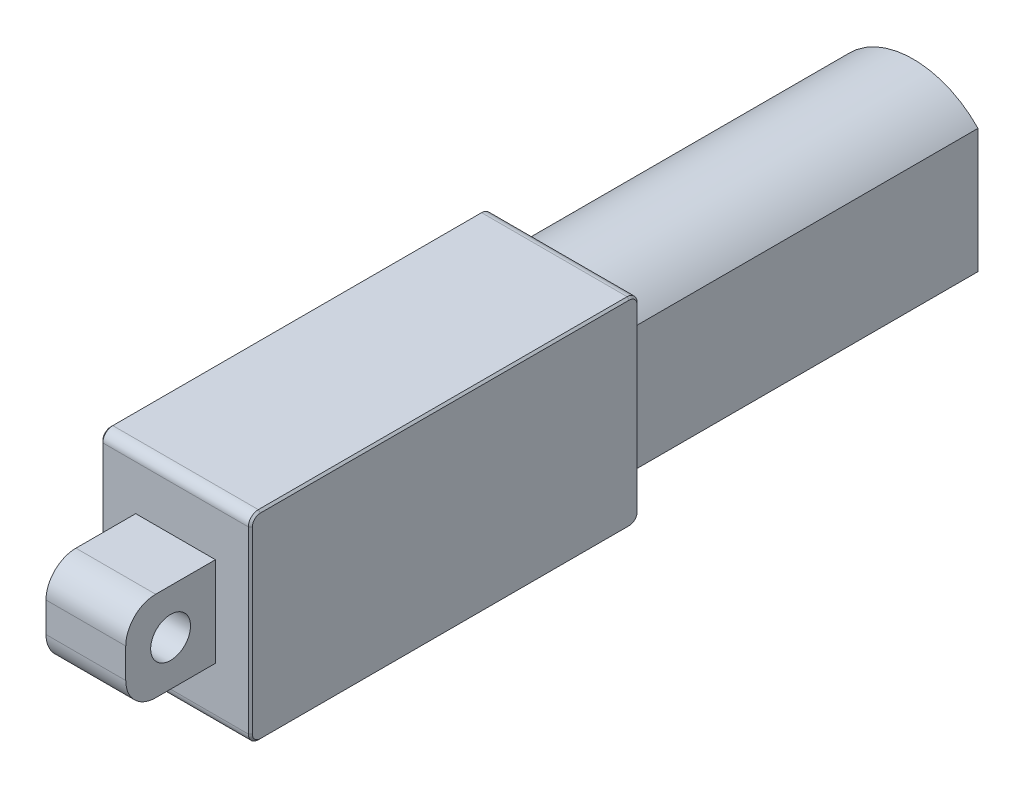
ISO-10303-21;
HEADER;
FILE_DESCRIPTION(('STEP AP214'),'2;1');
FILE_NAME('part.step','',(''),(''),'','','');
FILE_SCHEMA(('AUTOMOTIVE_DESIGN { 1 0 10303 214 1 1 1 1 }'));
ENDSEC;
DATA;
#1=APPLICATION_CONTEXT('core data for automotive mechanical design processes');
#2=APPLICATION_PROTOCOL_DEFINITION('international standard','automotive_design',2000,#1);
#3=PRODUCT_CONTEXT('',#1,'mechanical');
#4=PRODUCT('Part','Part','',(#3));
#5=PRODUCT_RELATED_PRODUCT_CATEGORY('part','',(#4));
#6=PRODUCT_DEFINITION_FORMATION('','',#4);
#7=PRODUCT_DEFINITION_CONTEXT('part definition',#1,'design');
#8=PRODUCT_DEFINITION('design','',#6,#7);
#9=PRODUCT_DEFINITION_SHAPE('','',#8);
#10=(LENGTH_UNIT() NAMED_UNIT(*) SI_UNIT(.MILLI.,.METRE.));
#11=(NAMED_UNIT(*) PLANE_ANGLE_UNIT() SI_UNIT($,.RADIAN.));
#12=(NAMED_UNIT(*) SI_UNIT($,.STERADIAN.) SOLID_ANGLE_UNIT());
#13=UNCERTAINTY_MEASURE_WITH_UNIT(LENGTH_MEASURE(1.E-05),#10,'distance_accuracy_value','');
#14=(GEOMETRIC_REPRESENTATION_CONTEXT(3) GLOBAL_UNCERTAINTY_ASSIGNED_CONTEXT((#13)) GLOBAL_UNIT_ASSIGNED_CONTEXT((#10,
#11,#12)) REPRESENTATION_CONTEXT('',''));
#15=CARTESIAN_POINT('',(0.,0.,0.));
#16=DIRECTION('',(0.,0.,1.));
#17=DIRECTION('',(1.,0.,0.));
#18=AXIS2_PLACEMENT_3D('',#15,#16,#17);
#19=CARTESIAN_POINT('',(0.,0.,-43.5));
#20=DIRECTION('',(0.,0.,1.));
#21=DIRECTION('',(0.,-1.,0.));
#22=AXIS2_PLACEMENT_3D('',#19,#20,#21);
#23=PLANE('',#22);
#24=DIRECTION('',(1.,0.,0.));
#25=VECTOR('',#24,1.);
#26=CARTESIAN_POINT('',(0.,9.,-43.5));
#27=LINE('',#26,#25);
#28=CARTESIAN_POINT('',(4.,9.,-43.5));
#29=VERTEX_POINT('',#28);
#30=CARTESIAN_POINT('',(11.3,9.,-43.5));
#31=VERTEX_POINT('',#30);
#32=EDGE_CURVE('E351',#29,#31,#27,.T.);
#33=ORIENTED_EDGE('',*,*,#32,.T.);
#34=DIRECTION('',(0.,-1.,0.));
#35=VECTOR('',#34,1.);
#36=CARTESIAN_POINT('',(11.3,0.,-43.5));
#37=LINE('',#36,#35);
#38=CARTESIAN_POINT('',(11.3,-9.,-43.5));
#39=VERTEX_POINT('',#38);
#40=EDGE_CURVE('E11',#31,#39,#37,.T.);
#41=ORIENTED_EDGE('',*,*,#40,.T.);
#42=DIRECTION('',(-1.,0.,0.));
#43=VECTOR('',#42,1.);
#44=CARTESIAN_POINT('',(0.,-9.,-43.5));
#45=LINE('',#44,#43);
#46=CARTESIAN_POINT('',(4.,-9.,-43.5));
#47=VERTEX_POINT('',#46);
#48=EDGE_CURVE('E362',#39,#47,#45,.T.);
#49=ORIENTED_EDGE('',*,*,#48,.T.);
#50=CARTESIAN_POINT('',(4.,0.,-43.5));
#51=DIRECTION('',(0.,0.,-1.));
#52=DIRECTION('',(0.,1.,0.));
#53=AXIS2_PLACEMENT_3D('',#50,#51,#52);
#54=CIRCLE('',#53,9.);
#55=CARTESIAN_POINT('',(10.5,-6.22494979899437,-43.5));
#56=VERTEX_POINT('',#55);
#57=EDGE_CURVE('E1082',#56,#47,#54,.T.);
#58=ORIENTED_EDGE('',*,*,#57,.F.);
#59=DIRECTION('',(0.,-1.,0.));
#60=VECTOR('',#59,1.);
#61=CARTESIAN_POINT('',(10.5,6.22494979899436,-43.5));
#62=LINE('',#61,#60);
#63=CARTESIAN_POINT('',(10.5,6.22494979899436,-43.5));
#64=VERTEX_POINT('',#63);
#65=EDGE_CURVE('E249',#64,#56,#62,.T.);
#66=ORIENTED_EDGE('',*,*,#65,.F.);
#67=CARTESIAN_POINT('',(4.,0.,-43.5));
#68=DIRECTION('',(0.,0.,-1.));
#69=DIRECTION('',(0.,1.,0.));
#70=AXIS2_PLACEMENT_3D('',#67,#68,#69);
#71=CIRCLE('',#70,9.);
#72=EDGE_CURVE('E1062',#29,#64,#71,.T.);
#73=ORIENTED_EDGE('',*,*,#72,.F.);
#74=EDGE_LOOP('',(#33,#41,#49,#58,#66,#73));
#75=FACE_BOUND('',#74,.T.);
#76=ADVANCED_FACE('F43',(#75),#23,.F.);
#77=DIRECTION('',(-1.,0.,0.));
#78=VECTOR('',#77,1.);
#79=CARTESIAN_POINT('',(0.,-9.,-43.5));
#80=LINE('',#79,#78);
#81=CARTESIAN_POINT('',(-3.3,-9.,-43.5));
#82=VERTEX_POINT('',#81);
#83=EDGE_CURVE('E358',#47,#82,#80,.T.);
#84=ORIENTED_EDGE('',*,*,#83,.T.);
#85=DIRECTION('',(0.,1.,0.));
#86=VECTOR('',#85,1.);
#87=CARTESIAN_POINT('',(-3.3,0.,-43.5));
#88=LINE('',#87,#86);
#89=CARTESIAN_POINT('',(-3.3,9.,-43.5));
#90=VERTEX_POINT('',#89);
#91=EDGE_CURVE('E418',#82,#90,#88,.T.);
#92=ORIENTED_EDGE('',*,*,#91,.T.);
#93=DIRECTION('',(1.,0.,0.));
#94=VECTOR('',#93,1.);
#95=CARTESIAN_POINT('',(0.,9.,-43.5));
#96=LINE('',#95,#94);
#97=EDGE_CURVE('E355',#90,#29,#96,.T.);
#98=ORIENTED_EDGE('',*,*,#97,.T.);
#99=CARTESIAN_POINT('',(-2.5,6.22494979899436,-43.5));
#100=VERTEX_POINT('',#99);
#101=EDGE_CURVE('E1059',#100,#29,#71,.T.);
#102=ORIENTED_EDGE('',*,*,#101,.F.);
#103=DIRECTION('',(0.,1.,0.));
#104=VECTOR('',#103,1.);
#105=CARTESIAN_POINT('',(-2.5,6.22494979899436,-43.5));
#106=LINE('',#105,#104);
#107=CARTESIAN_POINT('',(-2.5,-6.22494979899437,-43.5));
#108=VERTEX_POINT('',#107);
#109=EDGE_CURVE('E1070',#108,#100,#106,.T.);
#110=ORIENTED_EDGE('',*,*,#109,.F.);
#111=EDGE_CURVE('E254',#47,#108,#54,.T.);
#112=ORIENTED_EDGE('',*,*,#111,.F.);
#113=EDGE_LOOP('',(#84,#92,#98,#102,#110,#112));
#114=FACE_BOUND('',#113,.T.);
#115=ADVANCED_FACE('F576',(#114),#23,.F.);
#116=CARTESIAN_POINT('',(8.,-1.5,1.5));
#117=DIRECTION('',(-1.,0.,0.));
#118=DIRECTION('',(0.,0.,1.));
#119=AXIS2_PLACEMENT_3D('',#116,#117,#118);
#120=PLANE('',#119);
#121=CARTESIAN_POINT('',(8.,-1.5,1.5));
#122=DIRECTION('',(1.,0.,0.));
#123=DIRECTION('',(0.,0.,1.));
#124=AXIS2_PLACEMENT_3D('',#121,#122,#123);
#125=CIRCLE('',#124,3.);
#126=CARTESIAN_POINT('',(8.,-1.49999999999998,4.5));
#127=VERTEX_POINT('',#126);
#128=CARTESIAN_POINT('',(8.,-4.5,1.49999999999998));
#129=VERTEX_POINT('',#128);
#130=EDGE_CURVE('E272',#127,#129,#125,.T.);
#131=ORIENTED_EDGE('',*,*,#130,.T.);
#132=DIRECTION('',(0.,0.,-1.));
#133=VECTOR('',#132,1.);
#134=CARTESIAN_POINT('',(8.,-4.5,-4.5));
#135=LINE('',#134,#133);
#136=CARTESIAN_POINT('',(8.,-4.5,-4.5));
#137=VERTEX_POINT('',#136);
#138=EDGE_CURVE('E276',#129,#137,#135,.T.);
#139=ORIENTED_EDGE('',*,*,#138,.T.);
#140=DIRECTION('',(0.,1.,0.));
#141=VECTOR('',#140,1.);
#142=CARTESIAN_POINT('',(8.,4.5,-4.5));
#143=LINE('',#142,#141);
#144=CARTESIAN_POINT('',(8.,4.5,-4.5));
#145=VERTEX_POINT('',#144);
#146=EDGE_CURVE('E280',#137,#145,#143,.T.);
#147=ORIENTED_EDGE('',*,*,#146,.T.);
#148=DIRECTION('',(0.,0.,1.));
#149=VECTOR('',#148,1.);
#150=CARTESIAN_POINT('',(8.,4.5,0.));
#151=LINE('',#150,#149);
#152=CARTESIAN_POINT('',(8.,4.5,1.49999999999998));
#153=VERTEX_POINT('',#152);
#154=EDGE_CURVE('E283',#145,#153,#151,.T.);
#155=ORIENTED_EDGE('',*,*,#154,.T.);
#156=CARTESIAN_POINT('',(8.,1.5,1.5));
#157=DIRECTION('',(1.,0.,0.));
#158=DIRECTION('',(0.,0.,1.));
#159=AXIS2_PLACEMENT_3D('',#156,#157,#158);
#160=CIRCLE('',#159,3.);
#161=CARTESIAN_POINT('',(8.,1.49999999999998,4.5));
#162=VERTEX_POINT('',#161);
#163=EDGE_CURVE('E286',#153,#162,#160,.T.);
#164=ORIENTED_EDGE('',*,*,#163,.T.);
#165=DIRECTION('',(0.,-1.,0.));
#166=VECTOR('',#165,1.);
#167=CARTESIAN_POINT('',(8.,-1.49999999999998,4.5));
#168=LINE('',#167,#166);
#169=EDGE_CURVE('E289',#162,#127,#168,.T.);
#170=ORIENTED_EDGE('',*,*,#169,.T.);
#171=EDGE_LOOP('',(#131,#139,#147,#155,#164,#170));
#172=FACE_BOUND('',#171,.T.);
#173=CARTESIAN_POINT('',(8.,0.,0.));
#174=DIRECTION('',(1.,0.,0.));
#175=DIRECTION('',(0.,0.,-1.));
#176=AXIS2_PLACEMENT_3D('',#173,#174,#175);
#177=CIRCLE('',#176,2.);
#178=CARTESIAN_POINT('',(8.,0.,-2.));
#179=VERTEX_POINT('',#178);
#180=EDGE_CURVE('E262',#179,#179,#177,.T.);
#181=ORIENTED_EDGE('',*,*,#180,.F.);
#182=EDGE_LOOP('',(#181));
#183=FACE_BOUND('',#182,.T.);
#184=ADVANCED_FACE('F634',(#172,#183),#120,.F.);
#185=CARTESIAN_POINT('',(0.,-1.5,1.5));
#186=DIRECTION('',(-1.,0.,0.));
#187=DIRECTION('',(0.,0.,1.));
#188=AXIS2_PLACEMENT_3D('',#185,#186,#187);
#189=PLANE('',#188);
#190=CARTESIAN_POINT('',(0.,-1.5,1.5));
#191=DIRECTION('',(1.,0.,0.));
#192=DIRECTION('',(0.,0.,1.));
#193=AXIS2_PLACEMENT_3D('',#190,#191,#192);
#194=CIRCLE('',#193,3.);
#195=CARTESIAN_POINT('',(0.,-1.49999999999998,4.5));
#196=VERTEX_POINT('',#195);
#197=CARTESIAN_POINT('',(0.,-4.5,1.49999999999998));
#198=VERTEX_POINT('',#197);
#199=EDGE_CURVE('E270',#196,#198,#194,.T.);
#200=ORIENTED_EDGE('',*,*,#199,.F.);
#201=DIRECTION('',(0.,-1.,0.));
#202=VECTOR('',#201,1.);
#203=CARTESIAN_POINT('',(0.,-1.49999999999998,4.5));
#204=LINE('',#203,#202);
#205=CARTESIAN_POINT('',(0.,1.49999999999998,4.5));
#206=VERTEX_POINT('',#205);
#207=EDGE_CURVE('E277',#206,#196,#204,.T.);
#208=ORIENTED_EDGE('',*,*,#207,.F.);
#209=CARTESIAN_POINT('',(0.,1.5,1.5));
#210=DIRECTION('',(1.,0.,0.));
#211=DIRECTION('',(0.,0.,1.));
#212=AXIS2_PLACEMENT_3D('',#209,#210,#211);
#213=CIRCLE('',#212,3.);
#214=CARTESIAN_POINT('',(0.,4.5,1.49999999999998));
#215=VERTEX_POINT('',#214);
#216=EDGE_CURVE('E307',#215,#206,#213,.T.);
#217=ORIENTED_EDGE('',*,*,#216,.F.);
#218=DIRECTION('',(0.,0.,1.));
#219=VECTOR('',#218,1.);
#220=CARTESIAN_POINT('',(0.,4.5,1.49999999999998));
#221=LINE('',#220,#219);
#222=CARTESIAN_POINT('',(0.,4.5,-4.5));
#223=VERTEX_POINT('',#222);
#224=EDGE_CURVE('E304',#223,#215,#221,.T.);
#225=ORIENTED_EDGE('',*,*,#224,.F.);
#226=DIRECTION('',(0.,1.,0.));
#227=VECTOR('',#226,1.);
#228=CARTESIAN_POINT('',(0.,4.5,-4.5));
#229=LINE('',#228,#227);
#230=CARTESIAN_POINT('',(0.,-4.5,-4.5));
#231=VERTEX_POINT('',#230);
#232=EDGE_CURVE('E300',#231,#223,#229,.T.);
#233=ORIENTED_EDGE('',*,*,#232,.F.);
#234=DIRECTION('',(0.,0.,-1.));
#235=VECTOR('',#234,1.);
#236=CARTESIAN_POINT('',(0.,-4.5,-4.5));
#237=LINE('',#236,#235);
#238=EDGE_CURVE('E296',#198,#231,#237,.T.);
#239=ORIENTED_EDGE('',*,*,#238,.F.);
#240=EDGE_LOOP('',(#200,#208,#217,#225,#233,#239));
#241=FACE_BOUND('',#240,.T.);
#242=CARTESIAN_POINT('',(0.,0.,0.));
#243=DIRECTION('',(1.,0.,0.));
#244=DIRECTION('',(0.,0.,-1.));
#245=AXIS2_PLACEMENT_3D('',#242,#243,#244);
#246=CIRCLE('',#245,2.);
#247=CARTESIAN_POINT('',(0.,0.,-2.));
#248=VERTEX_POINT('',#247);
#249=EDGE_CURVE('E257',#248,#248,#246,.T.);
#250=ORIENTED_EDGE('',*,*,#249,.T.);
#251=EDGE_LOOP('',(#250));
#252=FACE_BOUND('',#251,.T.);
#253=ADVANCED_FACE('F656',(#241,#252),#189,.T.);
#254=CARTESIAN_POINT('',(8.,-1.5,1.5));
#255=DIRECTION('',(-1.,0.,0.));
#256=DIRECTION('',(0.,0.,1.));
#257=AXIS2_PLACEMENT_3D('',#254,#255,#256);
#258=CYLINDRICAL_SURFACE('',#257,3.);
#259=ORIENTED_EDGE('',*,*,#199,.T.);
#260=DIRECTION('',(-1.,0.,0.));
#261=VECTOR('',#260,1.);
#262=CARTESIAN_POINT('',(8.,-4.5,1.49999999999998));
#263=LINE('',#262,#261);
#264=EDGE_CURVE('E331',#129,#198,#263,.T.);
#265=ORIENTED_EDGE('',*,*,#264,.F.);
#266=ORIENTED_EDGE('',*,*,#130,.F.);
#267=DIRECTION('',(-1.,0.,0.));
#268=VECTOR('',#267,1.);
#269=CARTESIAN_POINT('',(8.,-1.49999999999998,4.5));
#270=LINE('',#269,#268);
#271=EDGE_CURVE('E292',#127,#196,#270,.T.);
#272=ORIENTED_EDGE('',*,*,#271,.T.);
#273=EDGE_LOOP('',(#259,#265,#266,#272));
#274=FACE_BOUND('',#273,.T.);
#275=ADVANCED_FACE('F660',(#274),#258,.T.);
#276=CARTESIAN_POINT('',(8.,-4.5,-4.5));
#277=DIRECTION('',(0.,1.,0.));
#278=DIRECTION('',(0.,0.,1.));
#279=AXIS2_PLACEMENT_3D('',#276,#277,#278);
#280=PLANE('',#279);
#281=ORIENTED_EDGE('',*,*,#238,.T.);
#282=DIRECTION('',(-1.,0.,0.));
#283=VECTOR('',#282,1.);
#284=CARTESIAN_POINT('',(8.,-4.5,-4.5));
#285=LINE('',#284,#283);
#286=EDGE_CURVE('E327',#137,#231,#285,.T.);
#287=ORIENTED_EDGE('',*,*,#286,.F.);
#288=ORIENTED_EDGE('',*,*,#138,.F.);
#289=ORIENTED_EDGE('',*,*,#264,.T.);
#290=EDGE_LOOP('',(#281,#287,#288,#289));
#291=FACE_BOUND('',#290,.T.);
#292=ADVANCED_FACE('F672',(#291),#280,.F.);
#293=CARTESIAN_POINT('',(8.,4.5,1.49999999999998));
#294=DIRECTION('',(0.,-1.,0.));
#295=DIRECTION('',(0.,0.,-1.));
#296=AXIS2_PLACEMENT_3D('',#293,#294,#295);
#297=PLANE('',#296);
#298=ORIENTED_EDGE('',*,*,#224,.T.);
#299=DIRECTION('',(-1.,0.,0.));
#300=VECTOR('',#299,1.);
#301=CARTESIAN_POINT('',(8.,4.5,1.49999999999998));
#302=LINE('',#301,#300);
#303=EDGE_CURVE('E319',#153,#215,#302,.T.);
#304=ORIENTED_EDGE('',*,*,#303,.F.);
#305=ORIENTED_EDGE('',*,*,#154,.F.);
#306=DIRECTION('',(-1.,0.,0.));
#307=VECTOR('',#306,1.);
#308=CARTESIAN_POINT('',(8.,4.5,-4.5));
#309=LINE('',#308,#307);
#310=EDGE_CURVE('E323',#145,#223,#309,.T.);
#311=ORIENTED_EDGE('',*,*,#310,.T.);
#312=EDGE_LOOP('',(#298,#304,#305,#311));
#313=FACE_BOUND('',#312,.T.);
#314=ADVANCED_FACE('F668',(#313),#297,.F.);
#315=CARTESIAN_POINT('',(8.,1.5,1.5));
#316=DIRECTION('',(-1.,0.,0.));
#317=DIRECTION('',(0.,0.,1.));
#318=AXIS2_PLACEMENT_3D('',#315,#316,#317);
#319=CYLINDRICAL_SURFACE('',#318,3.);
#320=ORIENTED_EDGE('',*,*,#216,.T.);
#321=DIRECTION('',(-1.,0.,0.));
#322=VECTOR('',#321,1.);
#323=CARTESIAN_POINT('',(8.,1.49999999999998,4.5));
#324=LINE('',#323,#322);
#325=EDGE_CURVE('E315',#162,#206,#324,.T.);
#326=ORIENTED_EDGE('',*,*,#325,.F.);
#327=ORIENTED_EDGE('',*,*,#163,.F.);
#328=ORIENTED_EDGE('',*,*,#303,.T.);
#329=EDGE_LOOP('',(#320,#326,#327,#328));
#330=FACE_BOUND('',#329,.T.);
#331=ADVANCED_FACE('F664',(#330),#319,.T.);
#332=CARTESIAN_POINT('',(8.,-1.49999999999998,4.5));
#333=DIRECTION('',(0.,0.,-1.));
#334=DIRECTION('',(-1.,0.,0.));
#335=AXIS2_PLACEMENT_3D('',#332,#333,#334);
#336=PLANE('',#335);
#337=ORIENTED_EDGE('',*,*,#207,.T.);
#338=ORIENTED_EDGE('',*,*,#271,.F.);
#339=ORIENTED_EDGE('',*,*,#169,.F.);
#340=ORIENTED_EDGE('',*,*,#325,.T.);
#341=EDGE_LOOP('',(#337,#338,#339,#340));
#342=FACE_BOUND('',#341,.T.);
#343=ADVANCED_FACE('F652',(#342),#336,.F.);
#344=CARTESIAN_POINT('',(8.,0.,0.));
#345=DIRECTION('',(-1.,0.,0.));
#346=DIRECTION('',(0.,0.,1.));
#347=AXIS2_PLACEMENT_3D('',#344,#345,#346);
#348=CYLINDRICAL_SURFACE('',#347,2.);
#349=ORIENTED_EDGE('',*,*,#180,.T.);
#350=EDGE_LOOP('',(#349));
#351=FACE_BOUND('',#350,.T.);
#352=ORIENTED_EDGE('',*,*,#249,.F.);
#353=EDGE_LOOP('',(#352));
#354=FACE_BOUND('',#353,.T.);
#355=ADVANCED_FACE('F649',(#351,#354),#348,.F.);
#356=CARTESIAN_POINT('',(11.5,-10.,-43.5));
#357=DIRECTION('',(-1.,0.,0.));
#358=DIRECTION('',(0.,0.,1.));
#359=AXIS2_PLACEMENT_3D('',#356,#357,#358);
#360=PLANE('',#359);
#361=CARTESIAN_POINT('',(11.5,-9.00000000000001,-5.5));
#362=DIRECTION('',(-1.,0.,0.));
#363=DIRECTION('',(0.,0.,1.));
#364=AXIS2_PLACEMENT_3D('',#361,#362,#363);
#365=CIRCLE('',#364,0.799999999999993);
#366=CARTESIAN_POINT('',(11.5,-9.00000000000001,-4.7));
#367=VERTEX_POINT('',#366);
#368=CARTESIAN_POINT('',(11.5,-9.8,-5.5));
#369=VERTEX_POINT('',#368);
#370=EDGE_CURVE('E70',#367,#369,#365,.F.);
#371=ORIENTED_EDGE('',*,*,#370,.T.);
#372=DIRECTION('',(0.,0.,-1.));
#373=VECTOR('',#372,1.);
#374=CARTESIAN_POINT('',(11.5,-9.79999999999999,-43.5));
#375=LINE('',#374,#373);
#376=CARTESIAN_POINT('',(11.5,-9.8,-42.5));
#377=VERTEX_POINT('',#376);
#378=EDGE_CURVE('E54',#369,#377,#375,.T.);
#379=ORIENTED_EDGE('',*,*,#378,.T.);
#380=CARTESIAN_POINT('',(11.5,-9.,-42.5));
#381=DIRECTION('',(-1.,0.,0.));
#382=DIRECTION('',(0.,0.,1.));
#383=AXIS2_PLACEMENT_3D('',#380,#381,#382);
#384=CIRCLE('',#383,0.799999999999995);
#385=CARTESIAN_POINT('',(11.5,-9.,-43.3));
#386=VERTEX_POINT('',#385);
#387=EDGE_CURVE('E462',#377,#386,#384,.F.);
#388=ORIENTED_EDGE('',*,*,#387,.T.);
#389=DIRECTION('',(0.,1.,0.));
#390=VECTOR('',#389,1.);
#391=CARTESIAN_POINT('',(11.5,-10.,-43.3));
#392=LINE('',#391,#390);
#393=CARTESIAN_POINT('',(11.5,9.,-43.3));
#394=VERTEX_POINT('',#393);
#395=EDGE_CURVE('E457',#386,#394,#392,.T.);
#396=ORIENTED_EDGE('',*,*,#395,.T.);
#397=CARTESIAN_POINT('',(11.5,9.,-42.5));
#398=DIRECTION('',(-1.,0.,0.));
#399=DIRECTION('',(0.,0.,1.));
#400=AXIS2_PLACEMENT_3D('',#397,#398,#399);
#401=CIRCLE('',#400,0.799999999999995);
#402=CARTESIAN_POINT('',(11.5,9.8,-42.5));
#403=VERTEX_POINT('',#402);
#404=EDGE_CURVE('E451',#394,#403,#401,.F.);
#405=ORIENTED_EDGE('',*,*,#404,.T.);
#406=DIRECTION('',(0.,0.,1.));
#407=VECTOR('',#406,1.);
#408=CARTESIAN_POINT('',(11.5,9.8,-43.5));
#409=LINE('',#408,#407);
#410=CARTESIAN_POINT('',(11.5,9.79999999999999,-5.5));
#411=VERTEX_POINT('',#410);
#412=EDGE_CURVE('E445',#403,#411,#409,.T.);
#413=ORIENTED_EDGE('',*,*,#412,.T.);
#414=CARTESIAN_POINT('',(11.5,9.,-5.5));
#415=DIRECTION('',(-1.,0.,0.));
#416=DIRECTION('',(0.,0.,1.));
#417=AXIS2_PLACEMENT_3D('',#414,#415,#416);
#418=CIRCLE('',#417,0.799999999999994);
#419=CARTESIAN_POINT('',(11.5,9.,-4.7));
#420=VERTEX_POINT('',#419);
#421=EDGE_CURVE('E448',#411,#420,#418,.F.);
#422=ORIENTED_EDGE('',*,*,#421,.T.);
#423=DIRECTION('',(0.,-1.,0.));
#424=VECTOR('',#423,1.);
#425=CARTESIAN_POINT('',(11.5,-9.00000000000001,-4.7));
#426=LINE('',#425,#424);
#427=EDGE_CURVE('E454',#420,#367,#426,.T.);
#428=ORIENTED_EDGE('',*,*,#427,.T.);
#429=EDGE_LOOP('',(#371,#379,#388,#396,#405,#413,#422,#428));
#430=FACE_BOUND('',#429,.T.);
#431=ADVANCED_FACE('F536',(#430),#360,.F.);
#432=CARTESIAN_POINT('',(-3.5,-10.,-43.5));
#433=DIRECTION('',(0.,1.,0.));
#434=DIRECTION('',(0.,0.,1.));
#435=AXIS2_PLACEMENT_3D('',#432,#433,#434);
#436=PLANE('',#435);
#437=DIRECTION('',(-1.,0.,0.));
#438=VECTOR('',#437,1.);
#439=CARTESIAN_POINT('',(-3.5,-10.,-5.5));
#440=LINE('',#439,#438);
#441=CARTESIAN_POINT('',(11.3,-10.,-5.5));
#442=VERTEX_POINT('',#441);
#443=CARTESIAN_POINT('',(-3.3,-10.,-5.5));
#444=VERTEX_POINT('',#443);
#445=EDGE_CURVE('E339',#442,#444,#440,.T.);
#446=ORIENTED_EDGE('',*,*,#445,.T.);
#447=DIRECTION('',(0.,0.,-1.));
#448=VECTOR('',#447,1.);
#449=CARTESIAN_POINT('',(-3.3,-10.,-43.5));
#450=LINE('',#449,#448);
#451=CARTESIAN_POINT('',(-3.3,-10.,-42.5));
#452=VERTEX_POINT('',#451);
#453=EDGE_CURVE('E402',#444,#452,#450,.T.);
#454=ORIENTED_EDGE('',*,*,#453,.T.);
#455=DIRECTION('',(-1.,0.,0.));
#456=VECTOR('',#455,1.);
#457=CARTESIAN_POINT('',(-3.5,-10.,-42.5));
#458=LINE('',#457,#456);
#459=CARTESIAN_POINT('',(11.3,-10.,-42.5));
#460=VERTEX_POINT('',#459);
#461=EDGE_CURVE('E335',#452,#460,#458,.F.);
#462=ORIENTED_EDGE('',*,*,#461,.T.);
#463=DIRECTION('',(0.,0.,1.));
#464=VECTOR('',#463,1.);
#465=CARTESIAN_POINT('',(11.3,-10.,-43.5));
#466=LINE('',#465,#464);
#467=EDGE_CURVE('E398',#460,#442,#466,.T.);
#468=ORIENTED_EDGE('',*,*,#467,.T.);
#469=EDGE_LOOP('',(#446,#454,#462,#468));
#470=FACE_BOUND('',#469,.T.);
#471=ADVANCED_FACE('F552',(#470),#436,.F.);
#472=CARTESIAN_POINT('',(-3.5,10.,-43.5));
#473=DIRECTION('',(1.,0.,0.));
#474=DIRECTION('',(0.,1.,0.));
#475=AXIS2_PLACEMENT_3D('',#472,#473,#474);
#476=PLANE('',#475);
#477=CARTESIAN_POINT('',(-3.5,-9.,-42.5));
#478=DIRECTION('',(1.,0.,0.));
#479=DIRECTION('',(0.,1.,0.));
#480=AXIS2_PLACEMENT_3D('',#477,#478,#479);
#481=CIRCLE('',#480,0.799999999999993);
#482=CARTESIAN_POINT('',(-3.5,-9.,-43.3));
#483=VERTEX_POINT('',#482);
#484=CARTESIAN_POINT('',(-3.5,-9.79999999999999,-42.5));
#485=VERTEX_POINT('',#484);
#486=EDGE_CURVE('E391',#483,#485,#481,.F.);
#487=ORIENTED_EDGE('',*,*,#486,.T.);
#488=DIRECTION('',(0.,0.,1.));
#489=VECTOR('',#488,1.);
#490=CARTESIAN_POINT('',(-3.5,-9.8,-43.5));
#491=LINE('',#490,#489);
#492=CARTESIAN_POINT('',(-3.5,-9.8,-5.5));
#493=VERTEX_POINT('',#492);
#494=EDGE_CURVE('E394',#485,#493,#491,.T.);
#495=ORIENTED_EDGE('',*,*,#494,.T.);
#496=CARTESIAN_POINT('',(-3.5,-9.00000000000001,-5.5));
#497=DIRECTION('',(1.,0.,0.));
#498=DIRECTION('',(0.,1.,0.));
#499=AXIS2_PLACEMENT_3D('',#496,#497,#498);
#500=CIRCLE('',#499,0.799999999999994);
#501=CARTESIAN_POINT('',(-3.5,-9.00000000000001,-4.70000000000001));
#502=VERTEX_POINT('',#501);
#503=EDGE_CURVE('E388',#493,#502,#500,.F.);
#504=ORIENTED_EDGE('',*,*,#503,.T.);
#505=DIRECTION('',(0.,1.,0.));
#506=VECTOR('',#505,1.);
#507=CARTESIAN_POINT('',(-3.5,9.,-4.70000000000001));
#508=LINE('',#507,#506);
#509=CARTESIAN_POINT('',(-3.5,9.,-4.7));
#510=VERTEX_POINT('',#509);
#511=EDGE_CURVE('E382',#502,#510,#508,.T.);
#512=ORIENTED_EDGE('',*,*,#511,.T.);
#513=CARTESIAN_POINT('',(-3.5,9.,-5.5));
#514=DIRECTION('',(1.,0.,0.));
#515=DIRECTION('',(0.,1.,0.));
#516=AXIS2_PLACEMENT_3D('',#513,#514,#515);
#517=CIRCLE('',#516,0.799999999999995);
#518=CARTESIAN_POINT('',(-3.5,9.79999999999999,-5.5));
#519=VERTEX_POINT('',#518);
#520=EDGE_CURVE('E376',#510,#519,#517,.F.);
#521=ORIENTED_EDGE('',*,*,#520,.T.);
#522=DIRECTION('',(0.,0.,-1.));
#523=VECTOR('',#522,1.);
#524=CARTESIAN_POINT('',(-3.5,9.8,-43.5));
#525=LINE('',#524,#523);
#526=CARTESIAN_POINT('',(-3.5,9.8,-42.5));
#527=VERTEX_POINT('',#526);
#528=EDGE_CURVE('E373',#519,#527,#525,.T.);
#529=ORIENTED_EDGE('',*,*,#528,.T.);
#530=CARTESIAN_POINT('',(-3.5,9.,-42.5));
#531=DIRECTION('',(1.,0.,0.));
#532=DIRECTION('',(0.,1.,0.));
#533=AXIS2_PLACEMENT_3D('',#530,#531,#532);
#534=CIRCLE('',#533,0.799999999999995);
#535=CARTESIAN_POINT('',(-3.5,9.,-43.3));
#536=VERTEX_POINT('',#535);
#537=EDGE_CURVE('E379',#527,#536,#534,.F.);
#538=ORIENTED_EDGE('',*,*,#537,.T.);
#539=DIRECTION('',(0.,-1.,0.));
#540=VECTOR('',#539,1.);
#541=CARTESIAN_POINT('',(-3.5,10.,-43.3));
#542=LINE('',#541,#540);
#543=EDGE_CURVE('E385',#536,#483,#542,.T.);
#544=ORIENTED_EDGE('',*,*,#543,.T.);
#545=EDGE_LOOP('',(#487,#495,#504,#512,#521,#529,#538,#544));
#546=FACE_BOUND('',#545,.T.);
#547=ADVANCED_FACE('F568',(#546),#476,.F.);
#548=CARTESIAN_POINT('',(4.,10.,-43.5));
#549=DIRECTION('',(0.,-1.,0.));
#550=DIRECTION('',(0.,0.,-1.));
#551=AXIS2_PLACEMENT_3D('',#548,#549,#550);
#552=PLANE('',#551);
#553=DIRECTION('',(1.,0.,0.));
#554=VECTOR('',#553,1.);
#555=CARTESIAN_POINT('',(4.,10.,-42.5));
#556=LINE('',#555,#554);
#557=CARTESIAN_POINT('',(11.3,10.,-42.5));
#558=VERTEX_POINT('',#557);
#559=CARTESIAN_POINT('',(-3.3,10.,-42.5));
#560=VERTEX_POINT('',#559);
#561=EDGE_CURVE('E369',#558,#560,#556,.F.);
#562=ORIENTED_EDGE('',*,*,#561,.T.);
#563=DIRECTION('',(0.,0.,1.));
#564=VECTOR('',#563,1.);
#565=CARTESIAN_POINT('',(-3.3,10.,-43.5));
#566=LINE('',#565,#564);
#567=CARTESIAN_POINT('',(-3.3,10.,-5.5));
#568=VERTEX_POINT('',#567);
#569=EDGE_CURVE('E442',#560,#568,#566,.T.);
#570=ORIENTED_EDGE('',*,*,#569,.T.);
#571=DIRECTION('',(1.,0.,0.));
#572=VECTOR('',#571,1.);
#573=CARTESIAN_POINT('',(11.5,10.,-5.5));
#574=LINE('',#573,#572);
#575=CARTESIAN_POINT('',(11.3,10.,-5.5));
#576=VERTEX_POINT('',#575);
#577=EDGE_CURVE('E365',#568,#576,#574,.T.);
#578=ORIENTED_EDGE('',*,*,#577,.T.);
#579=DIRECTION('',(0.,0.,-1.));
#580=VECTOR('',#579,1.);
#581=CARTESIAN_POINT('',(11.3,10.,-43.5));
#582=LINE('',#581,#580);
#583=EDGE_CURVE('E439',#576,#558,#582,.T.);
#584=ORIENTED_EDGE('',*,*,#583,.T.);
#585=EDGE_LOOP('',(#562,#570,#578,#584));
#586=FACE_BOUND('',#585,.T.);
#587=ADVANCED_FACE('F592',(#586),#552,.F.);
#588=CARTESIAN_POINT('',(0.,0.,-4.5));
#589=DIRECTION('',(0.,0.,1.));
#590=DIRECTION('',(0.,-1.,0.));
#591=AXIS2_PLACEMENT_3D('',#588,#589,#590);
#592=PLANE('',#591);
#593=ORIENTED_EDGE('',*,*,#286,.T.);
#594=ORIENTED_EDGE('',*,*,#232,.T.);
#595=ORIENTED_EDGE('',*,*,#310,.F.);
#596=ORIENTED_EDGE('',*,*,#146,.F.);
#597=EDGE_LOOP('',(#593,#594,#595,#596));
#598=FACE_BOUND('',#597,.T.);
#599=DIRECTION('',(1.,0.,0.));
#600=VECTOR('',#599,1.);
#601=CARTESIAN_POINT('',(-3.5,9.,-4.5));
#602=LINE('',#601,#600);
#603=CARTESIAN_POINT('',(11.3,9.,-4.5));
#604=VERTEX_POINT('',#603);
#605=CARTESIAN_POINT('',(-3.3,9.,-4.5));
#606=VERTEX_POINT('',#605);
#607=EDGE_CURVE('E343',#604,#606,#602,.F.);
#608=ORIENTED_EDGE('',*,*,#607,.T.);
#609=DIRECTION('',(0.,-1.,0.));
#610=VECTOR('',#609,1.);
#611=CARTESIAN_POINT('',(-3.3,-9.00000000000001,-4.5));
#612=LINE('',#611,#610);
#613=CARTESIAN_POINT('',(-3.3,-9.00000000000001,-4.5));
#614=VERTEX_POINT('',#613);
#615=EDGE_CURVE('E424',#606,#614,#612,.T.);
#616=ORIENTED_EDGE('',*,*,#615,.T.);
#617=DIRECTION('',(-1.,0.,0.));
#618=VECTOR('',#617,1.);
#619=CARTESIAN_POINT('',(11.5,-9.00000000000001,-4.5));
#620=LINE('',#619,#618);
#621=CARTESIAN_POINT('',(11.3,-9.00000000000001,-4.5));
#622=VERTEX_POINT('',#621);
#623=EDGE_CURVE('E347',#614,#622,#620,.F.);
#624=ORIENTED_EDGE('',*,*,#623,.T.);
#625=DIRECTION('',(0.,1.,0.));
#626=VECTOR('',#625,1.);
#627=CARTESIAN_POINT('',(11.3,9.,-4.5));
#628=LINE('',#627,#626);
#629=EDGE_CURVE('E421',#622,#604,#628,.T.);
#630=ORIENTED_EDGE('',*,*,#629,.T.);
#631=EDGE_LOOP('',(#608,#616,#624,#630));
#632=FACE_BOUND('',#631,.T.);
#633=ADVANCED_FACE('F608',(#598,#632),#592,.T.);
#634=CARTESIAN_POINT('',(4.,0.,-78.5));
#635=DIRECTION('',(0.,0.,1.));
#636=DIRECTION('',(0.,-1.,0.));
#637=AXIS2_PLACEMENT_3D('',#634,#635,#636);
#638=CYLINDRICAL_SURFACE('',#637,9.);
#639=ORIENTED_EDGE('',*,*,#57,.T.);
#640=ORIENTED_EDGE('',*,*,#111,.T.);
#641=DIRECTION('',(0.,0.,1.));
#642=VECTOR('',#641,1.);
#643=CARTESIAN_POINT('',(-2.5,-6.22494979899437,-78.5));
#644=LINE('',#643,#642);
#645=CARTESIAN_POINT('',(-2.5,-6.22494979899437,-78.5));
#646=VERTEX_POINT('',#645);
#647=EDGE_CURVE('E232',#646,#108,#644,.T.);
#648=ORIENTED_EDGE('',*,*,#647,.F.);
#649=CARTESIAN_POINT('',(4.,0.,-78.5));
#650=DIRECTION('',(0.,0.,-1.));
#651=DIRECTION('',(0.,1.,0.));
#652=AXIS2_PLACEMENT_3D('',#649,#650,#651);
#653=CIRCLE('',#652,9.);
#654=CARTESIAN_POINT('',(10.5,-6.22494979899436,-78.5));
#655=VERTEX_POINT('',#654);
#656=EDGE_CURVE('E239',#655,#646,#653,.T.);
#657=ORIENTED_EDGE('',*,*,#656,.F.);
#658=DIRECTION('',(0.,0.,1.));
#659=VECTOR('',#658,1.);
#660=CARTESIAN_POINT('',(10.5,-6.22494979899436,-78.5));
#661=LINE('',#660,#659);
#662=EDGE_CURVE('E1074',#655,#56,#661,.T.);
#663=ORIENTED_EDGE('',*,*,#662,.T.);
#664=EDGE_LOOP('',(#639,#640,#648,#657,#663));
#665=FACE_BOUND('',#664,.T.);
#666=ADVANCED_FACE('F252',(#665),#638,.T.);
#667=CARTESIAN_POINT('',(-2.5,6.22494979899437,-78.5));
#668=DIRECTION('',(1.,0.,0.));
#669=DIRECTION('',(0.,0.,-1.));
#670=AXIS2_PLACEMENT_3D('',#667,#668,#669);
#671=PLANE('',#670);
#672=ORIENTED_EDGE('',*,*,#109,.T.);
#673=DIRECTION('',(0.,0.,1.));
#674=VECTOR('',#673,1.);
#675=CARTESIAN_POINT('',(-2.5,6.22494979899437,-78.5));
#676=LINE('',#675,#674);
#677=CARTESIAN_POINT('',(-2.5,6.22494979899437,-78.5));
#678=VERTEX_POINT('',#677);
#679=EDGE_CURVE('E234',#678,#100,#676,.T.);
#680=ORIENTED_EDGE('',*,*,#679,.F.);
#681=DIRECTION('',(0.,1.,0.));
#682=VECTOR('',#681,1.);
#683=CARTESIAN_POINT('',(-2.5,6.22494979899437,-78.5));
#684=LINE('',#683,#682);
#685=EDGE_CURVE('E227',#646,#678,#684,.T.);
#686=ORIENTED_EDGE('',*,*,#685,.F.);
#687=ORIENTED_EDGE('',*,*,#647,.T.);
#688=EDGE_LOOP('',(#672,#680,#686,#687));
#689=FACE_BOUND('',#688,.T.);
#690=ADVANCED_FACE('F230',(#689),#671,.F.);
#691=CARTESIAN_POINT('',(4.,0.,-78.5));
#692=DIRECTION('',(0.,0.,1.));
#693=DIRECTION('',(0.,-1.,0.));
#694=AXIS2_PLACEMENT_3D('',#691,#692,#693);
#695=CYLINDRICAL_SURFACE('',#694,9.);
#696=ORIENTED_EDGE('',*,*,#101,.T.);
#697=ORIENTED_EDGE('',*,*,#72,.T.);
#698=DIRECTION('',(0.,0.,1.));
#699=VECTOR('',#698,1.);
#700=CARTESIAN_POINT('',(10.5,6.22494979899436,-78.5));
#701=LINE('',#700,#699);
#702=CARTESIAN_POINT('',(10.5,6.22494979899436,-78.5));
#703=VERTEX_POINT('',#702);
#704=EDGE_CURVE('E264',#703,#64,#701,.T.);
#705=ORIENTED_EDGE('',*,*,#704,.F.);
#706=CARTESIAN_POINT('',(4.,0.,-78.5));
#707=DIRECTION('',(0.,0.,-1.));
#708=DIRECTION('',(0.,1.,0.));
#709=AXIS2_PLACEMENT_3D('',#706,#707,#708);
#710=CIRCLE('',#709,9.);
#711=EDGE_CURVE('E238',#678,#703,#710,.T.);
#712=ORIENTED_EDGE('',*,*,#711,.F.);
#713=ORIENTED_EDGE('',*,*,#679,.T.);
#714=EDGE_LOOP('',(#696,#697,#705,#712,#713));
#715=FACE_BOUND('',#714,.T.);
#716=ADVANCED_FACE('F900',(#715),#695,.T.);
#717=CARTESIAN_POINT('',(10.5,6.22494979899436,-78.5));
#718=DIRECTION('',(-1.,0.,0.));
#719=DIRECTION('',(0.,0.,1.));
#720=AXIS2_PLACEMENT_3D('',#717,#718,#719);
#721=PLANE('',#720);
#722=ORIENTED_EDGE('',*,*,#65,.T.);
#723=ORIENTED_EDGE('',*,*,#662,.F.);
#724=DIRECTION('',(0.,-1.,0.));
#725=VECTOR('',#724,1.);
#726=CARTESIAN_POINT('',(10.5,6.22494979899436,-78.5));
#727=LINE('',#726,#725);
#728=EDGE_CURVE('E244',#703,#655,#727,.T.);
#729=ORIENTED_EDGE('',*,*,#728,.F.);
#730=ORIENTED_EDGE('',*,*,#704,.T.);
#731=EDGE_LOOP('',(#722,#723,#729,#730));
#732=FACE_BOUND('',#731,.T.);
#733=ADVANCED_FACE('F890',(#732),#721,.F.);
#734=CARTESIAN_POINT('',(4.,0.,-78.5));
#735=DIRECTION('',(0.,0.,-1.));
#736=DIRECTION('',(0.,1.,0.));
#737=AXIS2_PLACEMENT_3D('',#734,#735,#736);
#738=PLANE('',#737);
#739=CARTESIAN_POINT('',(4.,0.,-78.5));
#740=DIRECTION('',(0.,0.,-1.));
#741=DIRECTION('',(0.,1.,0.));
#742=AXIS2_PLACEMENT_3D('',#739,#740,#741);
#743=CIRCLE('',#742,4.5);
#744=CARTESIAN_POINT('',(4.,4.5,-78.5));
#745=VERTEX_POINT('',#744);
#746=EDGE_CURVE('E497',#745,#745,#743,.T.);
#747=ORIENTED_EDGE('',*,*,#746,.F.);
#748=EDGE_LOOP('',(#747));
#749=FACE_BOUND('',#748,.T.);
#750=ORIENTED_EDGE('',*,*,#656,.T.);
#751=ORIENTED_EDGE('',*,*,#685,.T.);
#752=ORIENTED_EDGE('',*,*,#711,.T.);
#753=ORIENTED_EDGE('',*,*,#728,.T.);
#754=EDGE_LOOP('',(#750,#751,#752,#753));
#755=FACE_BOUND('',#754,.T.);
#756=ADVANCED_FACE('F242',(#749,#755),#738,.T.);
#757=CARTESIAN_POINT('',(4.,0.,-23.5));
#758=DIRECTION('',(0.,0.,-1.));
#759=DIRECTION('',(0.,1.,0.));
#760=AXIS2_PLACEMENT_3D('',#757,#758,#759);
#761=CYLINDRICAL_SURFACE('',#760,4.5);
#762=CARTESIAN_POINT('',(4.,0.,-23.5));
#763=DIRECTION('',(0.,0.,-1.));
#764=DIRECTION('',(0.,1.,0.));
#765=AXIS2_PLACEMENT_3D('',#762,#763,#764);
#766=CIRCLE('',#765,4.5);
#767=CARTESIAN_POINT('',(4.,4.49999999999999,-23.5));
#768=VERTEX_POINT('',#767);
#769=EDGE_CURVE('E1086',#768,#768,#766,.T.);
#770=ORIENTED_EDGE('',*,*,#769,.F.);
#771=EDGE_LOOP('',(#770));
#772=FACE_BOUND('',#771,.T.);
#773=ORIENTED_EDGE('',*,*,#746,.T.);
#774=EDGE_LOOP('',(#773));
#775=FACE_BOUND('',#774,.T.);
#776=ADVANCED_FACE('F871',(#772,#775),#761,.F.);
#777=CARTESIAN_POINT('',(4.,0.,-23.5));
#778=DIRECTION('',(0.,0.,-1.));
#779=DIRECTION('',(0.,1.,0.));
#780=AXIS2_PLACEMENT_3D('',#777,#778,#779);
#781=PLANE('',#780);
#782=ORIENTED_EDGE('',*,*,#769,.T.);
#783=EDGE_LOOP('',(#782));
#784=FACE_BOUND('',#783,.T.);
#785=ADVANCED_FACE('F683',(#784),#781,.T.);
#786=CARTESIAN_POINT('',(-3.5,-9.00000000000001,-5.5));
#787=DIRECTION('',(1.,0.,0.));
#788=DIRECTION('',(0.,0.,-1.));
#789=AXIS2_PLACEMENT_3D('',#786,#787,#788);
#790=CYLINDRICAL_SURFACE('',#789,1.);
#791=ORIENTED_EDGE('',*,*,#623,.F.);
#792=CARTESIAN_POINT('',(-3.3,-9.00000000000001,-5.5));
#793=DIRECTION('',(1.,0.,0.));
#794=DIRECTION('',(0.,0.,-1.));
#795=AXIS2_PLACEMENT_3D('',#792,#793,#794);
#796=CIRCLE('',#795,1.);
#797=EDGE_CURVE('E415',#614,#444,#796,.T.);
#798=ORIENTED_EDGE('',*,*,#797,.T.);
#799=ORIENTED_EDGE('',*,*,#445,.F.);
#800=CARTESIAN_POINT('',(11.3,-9.00000000000001,-5.5));
#801=DIRECTION('',(-1.,0.,0.));
#802=DIRECTION('',(0.,0.,1.));
#803=AXIS2_PLACEMENT_3D('',#800,#801,#802);
#804=CIRCLE('',#803,1.);
#805=EDGE_CURVE('E412',#442,#622,#804,.T.);
#806=ORIENTED_EDGE('',*,*,#805,.T.);
#807=EDGE_LOOP('',(#791,#798,#799,#806));
#808=FACE_BOUND('',#807,.T.);
#809=ADVANCED_FACE('F680',(#808),#790,.T.);
#810=CARTESIAN_POINT('',(0.,-9.,-42.5));
#811=DIRECTION('',(-1.,0.,0.));
#812=DIRECTION('',(0.,0.,1.));
#813=AXIS2_PLACEMENT_3D('',#810,#811,#812);
#814=CYLINDRICAL_SURFACE('',#813,1.);
#815=ORIENTED_EDGE('',*,*,#461,.F.);
#816=CARTESIAN_POINT('',(-3.3,-9.,-42.5));
#817=DIRECTION('',(1.,0.,0.));
#818=DIRECTION('',(0.,0.,-1.));
#819=AXIS2_PLACEMENT_3D('',#816,#817,#818);
#820=CIRCLE('',#819,1.);
#821=EDGE_CURVE('E409',#452,#82,#820,.T.);
#822=ORIENTED_EDGE('',*,*,#821,.T.);
#823=ORIENTED_EDGE('',*,*,#83,.F.);
#824=ORIENTED_EDGE('',*,*,#48,.F.);
#825=CARTESIAN_POINT('',(11.3,-9.,-42.5));
#826=DIRECTION('',(-1.,0.,0.));
#827=DIRECTION('',(0.,0.,1.));
#828=AXIS2_PLACEMENT_3D('',#825,#826,#827);
#829=CIRCLE('',#828,1.);
#830=EDGE_CURVE('E406',#39,#460,#829,.T.);
#831=ORIENTED_EDGE('',*,*,#830,.T.);
#832=EDGE_LOOP('',(#815,#822,#823,#824,#831));
#833=FACE_BOUND('',#832,.T.);
#834=ADVANCED_FACE('F549',(#833),#814,.T.);
#835=CARTESIAN_POINT('',(0.,9.,-42.5));
#836=DIRECTION('',(1.,0.,0.));
#837=DIRECTION('',(0.,0.,-1.));
#838=AXIS2_PLACEMENT_3D('',#835,#836,#837);
#839=CYLINDRICAL_SURFACE('',#838,1.);
#840=ORIENTED_EDGE('',*,*,#97,.F.);
#841=CARTESIAN_POINT('',(-3.3,9.,-42.5));
#842=DIRECTION('',(1.,0.,0.));
#843=DIRECTION('',(0.,0.,-1.));
#844=AXIS2_PLACEMENT_3D('',#841,#842,#843);
#845=CIRCLE('',#844,1.);
#846=EDGE_CURVE('E430',#90,#560,#845,.T.);
#847=ORIENTED_EDGE('',*,*,#846,.T.);
#848=ORIENTED_EDGE('',*,*,#561,.F.);
#849=CARTESIAN_POINT('',(11.3,9.,-42.5));
#850=DIRECTION('',(-1.,0.,0.));
#851=DIRECTION('',(0.,0.,1.));
#852=AXIS2_PLACEMENT_3D('',#849,#850,#851);
#853=CIRCLE('',#852,1.);
#854=EDGE_CURVE('E427',#558,#31,#853,.T.);
#855=ORIENTED_EDGE('',*,*,#854,.T.);
#856=ORIENTED_EDGE('',*,*,#32,.F.);
#857=EDGE_LOOP('',(#840,#847,#848,#855,#856));
#858=FACE_BOUND('',#857,.T.);
#859=ADVANCED_FACE('F588',(#858),#839,.T.);
#860=CARTESIAN_POINT('',(4.,9.,-5.5));
#861=DIRECTION('',(-1.,0.,0.));
#862=DIRECTION('',(0.,0.,1.));
#863=AXIS2_PLACEMENT_3D('',#860,#861,#862);
#864=CYLINDRICAL_SURFACE('',#863,1.);
#865=ORIENTED_EDGE('',*,*,#577,.F.);
#866=CARTESIAN_POINT('',(-3.3,9.,-5.5));
#867=DIRECTION('',(1.,0.,0.));
#868=DIRECTION('',(0.,0.,-1.));
#869=AXIS2_PLACEMENT_3D('',#866,#867,#868);
#870=CIRCLE('',#869,1.);
#871=EDGE_CURVE('E436',#568,#606,#870,.T.);
#872=ORIENTED_EDGE('',*,*,#871,.T.);
#873=ORIENTED_EDGE('',*,*,#607,.F.);
#874=CARTESIAN_POINT('',(11.3,9.,-5.5));
#875=DIRECTION('',(-1.,0.,0.));
#876=DIRECTION('',(0.,0.,1.));
#877=AXIS2_PLACEMENT_3D('',#874,#875,#876);
#878=CIRCLE('',#877,1.);
#879=EDGE_CURVE('E433',#604,#576,#878,.T.);
#880=ORIENTED_EDGE('',*,*,#879,.T.);
#881=EDGE_LOOP('',(#865,#872,#873,#880));
#882=FACE_BOUND('',#881,.T.);
#883=ADVANCED_FACE('F606',(#882),#864,.T.);
#884=CARTESIAN_POINT('',(-3.3,10.,-43.5));
#885=DIRECTION('',(0.70710678118656,-0.707106781186535,0.));
#886=DIRECTION('',(0.,0.,1.));
#887=AXIS2_PLACEMENT_3D('',#884,#885,#886);
#888=PLANE('',#887);
#889=DIRECTION('',(-0.707106781186535,-0.70710678118656,0.));
#890=VECTOR('',#889,1.);
#891=CARTESIAN_POINT('',(-3.3,10.,-5.5));
#892=LINE('',#891,#890);
#893=EDGE_CURVE('E489',#568,#519,#892,.T.);
#894=ORIENTED_EDGE('',*,*,#893,.F.);
#895=ORIENTED_EDGE('',*,*,#569,.F.);
#896=DIRECTION('',(0.707106781186535,0.70710678118656,0.));
#897=VECTOR('',#896,1.);
#898=CARTESIAN_POINT('',(-3.5,9.8,-42.5));
#899=LINE('',#898,#897);
#900=EDGE_CURVE('E493',#527,#560,#899,.T.);
#901=ORIENTED_EDGE('',*,*,#900,.F.);
#902=ORIENTED_EDGE('',*,*,#528,.F.);
#903=EDGE_LOOP('',(#894,#895,#901,#902));
#904=FACE_BOUND('',#903,.T.);
#905=ADVANCED_FACE('F596',(#904),#888,.F.);
#906=CARTESIAN_POINT('',(-3.5,9.,-42.5));
#907=DIRECTION('',(1.,0.,0.));
#908=DIRECTION('',(0.,0.,-1.));
#909=AXIS2_PLACEMENT_3D('',#906,#907,#908);
#910=CONICAL_SURFACE('',#909,0.799999999999995,0.785398163397463);
#911=ORIENTED_EDGE('',*,*,#900,.T.);
#912=ORIENTED_EDGE('',*,*,#846,.F.);
#913=DIRECTION('',(0.707106781186535,0.,-0.70710678118656));
#914=VECTOR('',#913,1.);
#915=CARTESIAN_POINT('',(-3.5,9.,-43.3));
#916=LINE('',#915,#914);
#917=EDGE_CURVE('E485',#536,#90,#916,.T.);
#918=ORIENTED_EDGE('',*,*,#917,.F.);
#919=ORIENTED_EDGE('',*,*,#537,.F.);
#920=EDGE_LOOP('',(#911,#912,#918,#919));
#921=FACE_BOUND('',#920,.T.);
#922=ADVANCED_FACE('F584',(#921),#910,.T.);
#923=CARTESIAN_POINT('',(-3.5,9.,-5.5));
#924=DIRECTION('',(1.,0.,0.));
#925=DIRECTION('',(0.,0.,-1.));
#926=AXIS2_PLACEMENT_3D('',#923,#924,#925);
#927=CONICAL_SURFACE('',#926,0.799999999999995,0.785398163397463);
#928=ORIENTED_EDGE('',*,*,#893,.T.);
#929=ORIENTED_EDGE('',*,*,#520,.F.);
#930=DIRECTION('',(-0.707106781186537,0.,-0.707106781186558));
#931=VECTOR('',#930,1.);
#932=CARTESIAN_POINT('',(-3.3,9.,-4.5));
#933=LINE('',#932,#931);
#934=EDGE_CURVE('E481',#606,#510,#933,.T.);
#935=ORIENTED_EDGE('',*,*,#934,.F.);
#936=ORIENTED_EDGE('',*,*,#871,.F.);
#937=EDGE_LOOP('',(#928,#929,#935,#936));
#938=FACE_BOUND('',#937,.T.);
#939=ADVANCED_FACE('F602',(#938),#927,.T.);
#940=CARTESIAN_POINT('',(-3.3,0.,-43.5));
#941=DIRECTION('',(0.707106781186558,0.,0.707106781186537));
#942=DIRECTION('',(0.,1.,0.));
#943=AXIS2_PLACEMENT_3D('',#940,#941,#942);
#944=PLANE('',#943);
#945=ORIENTED_EDGE('',*,*,#917,.T.);
#946=ORIENTED_EDGE('',*,*,#91,.F.);
#947=DIRECTION('',(0.707106781186535,0.,-0.70710678118656));
#948=VECTOR('',#947,1.);
#949=CARTESIAN_POINT('',(-3.5,-9.,-43.3));
#950=LINE('',#949,#948);
#951=EDGE_CURVE('E477',#483,#82,#950,.T.);
#952=ORIENTED_EDGE('',*,*,#951,.F.);
#953=ORIENTED_EDGE('',*,*,#543,.F.);
#954=EDGE_LOOP('',(#945,#946,#952,#953));
#955=FACE_BOUND('',#954,.T.);
#956=ADVANCED_FACE('F579',(#955),#944,.F.);
#957=CARTESIAN_POINT('',(-3.5,10.,-4.70000000000001));
#958=DIRECTION('',(-0.707106781186567,0.,0.707106781186528));
#959=DIRECTION('',(0.,-1.,0.));
#960=AXIS2_PLACEMENT_3D('',#957,#958,#959);
#961=PLANE('',#960);
#962=ORIENTED_EDGE('',*,*,#934,.T.);
#963=ORIENTED_EDGE('',*,*,#511,.F.);
#964=DIRECTION('',(-0.707106781186528,0.,-0.707106781186567));
#965=VECTOR('',#964,1.);
#966=CARTESIAN_POINT('',(-3.3,-9.00000000000001,-4.5));
#967=LINE('',#966,#965);
#968=EDGE_CURVE('E473',#614,#502,#967,.T.);
#969=ORIENTED_EDGE('',*,*,#968,.F.);
#970=ORIENTED_EDGE('',*,*,#615,.F.);
#971=EDGE_LOOP('',(#962,#963,#969,#970));
#972=FACE_BOUND('',#971,.T.);
#973=ADVANCED_FACE('F707',(#972),#961,.T.);
#974=CARTESIAN_POINT('',(-3.5,-9.,-42.5));
#975=DIRECTION('',(1.,0.,0.));
#976=DIRECTION('',(0.,0.,-1.));
#977=AXIS2_PLACEMENT_3D('',#974,#975,#976);
#978=CONICAL_SURFACE('',#977,0.799999999999993,0.785398163397468);
#979=ORIENTED_EDGE('',*,*,#951,.T.);
#980=ORIENTED_EDGE('',*,*,#821,.F.);
#981=DIRECTION('',(0.707106781186535,-0.70710678118656,0.));
#982=VECTOR('',#981,1.);
#983=CARTESIAN_POINT('',(-3.5,-9.79999999999999,-42.5));
#984=LINE('',#983,#982);
#985=EDGE_CURVE('E470',#485,#452,#984,.T.);
#986=ORIENTED_EDGE('',*,*,#985,.F.);
#987=ORIENTED_EDGE('',*,*,#486,.F.);
#988=EDGE_LOOP('',(#979,#980,#986,#987));
#989=FACE_BOUND('',#988,.T.);
#990=ADVANCED_FACE('F573',(#989),#978,.T.);
#991=CARTESIAN_POINT('',(-3.5,-9.00000000000001,-5.5));
#992=DIRECTION('',(1.,0.,0.));
#993=DIRECTION('',(0.,0.,-1.));
#994=AXIS2_PLACEMENT_3D('',#991,#992,#993);
#995=CONICAL_SURFACE('',#994,0.799999999999994,0.785398163397466);
#996=ORIENTED_EDGE('',*,*,#968,.T.);
#997=ORIENTED_EDGE('',*,*,#503,.F.);
#998=DIRECTION('',(-0.707106781186538,0.707106781186557,0.));
#999=VECTOR('',#998,1.);
#1000=CARTESIAN_POINT('',(-3.3,-10.,-5.5));
#1001=LINE('',#1000,#999);
#1002=EDGE_CURVE('E467',#444,#493,#1001,.T.);
#1003=ORIENTED_EDGE('',*,*,#1002,.F.);
#1004=ORIENTED_EDGE('',*,*,#797,.F.);
#1005=EDGE_LOOP('',(#996,#997,#1003,#1004));
#1006=FACE_BOUND('',#1005,.T.);
#1007=ADVANCED_FACE('F564',(#1006),#995,.T.);
#1008=CARTESIAN_POINT('',(-3.5,-9.8,-43.5));
#1009=DIRECTION('',(0.707106781186557,0.707106781186538,0.));
#1010=DIRECTION('',(0.,0.,1.));
#1011=AXIS2_PLACEMENT_3D('',#1008,#1009,#1010);
#1012=PLANE('',#1011);
#1013=ORIENTED_EDGE('',*,*,#985,.T.);
#1014=ORIENTED_EDGE('',*,*,#453,.F.);
#1015=ORIENTED_EDGE('',*,*,#1002,.T.);
#1016=ORIENTED_EDGE('',*,*,#494,.F.);
#1017=EDGE_LOOP('',(#1013,#1014,#1015,#1016));
#1018=FACE_BOUND('',#1017,.T.);
#1019=ADVANCED_FACE('F557',(#1018),#1012,.F.);
#1020=CARTESIAN_POINT('',(11.5,9.8,-43.5));
#1021=DIRECTION('',(-0.707106781186544,-0.707106781186551,0.));
#1022=DIRECTION('',(0.,0.,1.));
#1023=AXIS2_PLACEMENT_3D('',#1020,#1021,#1022);
#1024=PLANE('',#1023);
#1025=DIRECTION('',(-0.707106781186551,0.707106781186544,0.));
#1026=VECTOR('',#1025,1.);
#1027=CARTESIAN_POINT('',(11.5,9.79999999999999,-5.5));
#1028=LINE('',#1027,#1026);
#1029=EDGE_CURVE('E518',#411,#576,#1028,.T.);
#1030=ORIENTED_EDGE('',*,*,#1029,.F.);
#1031=ORIENTED_EDGE('',*,*,#412,.F.);
#1032=DIRECTION('',(0.707106781186551,-0.707106781186544,0.));
#1033=VECTOR('',#1032,1.);
#1034=CARTESIAN_POINT('',(11.3,10.,-42.5));
#1035=LINE('',#1034,#1033);
#1036=EDGE_CURVE('E48',#558,#403,#1035,.T.);
#1037=ORIENTED_EDGE('',*,*,#1036,.F.);
#1038=ORIENTED_EDGE('',*,*,#583,.F.);
#1039=EDGE_LOOP('',(#1030,#1031,#1037,#1038));
#1040=FACE_BOUND('',#1039,.T.);
#1041=ADVANCED_FACE('F46',(#1040),#1024,.F.);
#1042=CARTESIAN_POINT('',(11.5,9.,-42.5));
#1043=DIRECTION('',(-1.,0.,0.));
#1044=DIRECTION('',(0.,0.,1.));
#1045=AXIS2_PLACEMENT_3D('',#1042,#1043,#1044);
#1046=CONICAL_SURFACE('',#1045,0.799999999999995,0.785398163397446);
#1047=ORIENTED_EDGE('',*,*,#1036,.T.);
#1048=ORIENTED_EDGE('',*,*,#404,.F.);
#1049=DIRECTION('',(0.707106781186548,0.,0.707106781186548));
#1050=VECTOR('',#1049,1.);
#1051=CARTESIAN_POINT('',(11.3,9.,-43.5));
#1052=LINE('',#1051,#1050);
#1053=EDGE_CURVE('E515',#31,#394,#1052,.T.);
#1054=ORIENTED_EDGE('',*,*,#1053,.F.);
#1055=ORIENTED_EDGE('',*,*,#854,.F.);
#1056=EDGE_LOOP('',(#1047,#1048,#1054,#1055));
#1057=FACE_BOUND('',#1056,.T.);
#1058=ADVANCED_FACE('F531',(#1057),#1046,.T.);
#1059=CARTESIAN_POINT('',(11.5,9.,-5.5));
#1060=DIRECTION('',(-1.,0.,0.));
#1061=DIRECTION('',(0.,0.,1.));
#1062=AXIS2_PLACEMENT_3D('',#1059,#1060,#1061);
#1063=CONICAL_SURFACE('',#1062,0.799999999999994,0.785398163397448);
#1064=ORIENTED_EDGE('',*,*,#1029,.T.);
#1065=ORIENTED_EDGE('',*,*,#879,.F.);
#1066=DIRECTION('',(-0.707106781186548,0.,0.707106781186548));
#1067=VECTOR('',#1066,1.);
#1068=CARTESIAN_POINT('',(11.5,9.,-4.7));
#1069=LINE('',#1068,#1067);
#1070=EDGE_CURVE('E511',#420,#604,#1069,.T.);
#1071=ORIENTED_EDGE('',*,*,#1070,.F.);
#1072=ORIENTED_EDGE('',*,*,#421,.F.);
#1073=EDGE_LOOP('',(#1064,#1065,#1071,#1072));
#1074=FACE_BOUND('',#1073,.T.);
#1075=ADVANCED_FACE('F774',(#1074),#1063,.T.);
#1076=CARTESIAN_POINT('',(11.3,0.,-43.5));
#1077=DIRECTION('',(-0.707106781186549,0.,0.707106781186546));
#1078=DIRECTION('',(0.,-1.,0.));
#1079=AXIS2_PLACEMENT_3D('',#1076,#1077,#1078);
#1080=PLANE('',#1079);
#1081=ORIENTED_EDGE('',*,*,#1053,.T.);
#1082=ORIENTED_EDGE('',*,*,#395,.F.);
#1083=DIRECTION('',(0.707106781186548,0.,0.707106781186548));
#1084=VECTOR('',#1083,1.);
#1085=CARTESIAN_POINT('',(11.3,-9.,-43.5));
#1086=LINE('',#1085,#1084);
#1087=EDGE_CURVE('E507',#39,#386,#1086,.T.);
#1088=ORIENTED_EDGE('',*,*,#1087,.F.);
#1089=ORIENTED_EDGE('',*,*,#40,.F.);
#1090=EDGE_LOOP('',(#1081,#1082,#1088,#1089));
#1091=FACE_BOUND('',#1090,.T.);
#1092=ADVANCED_FACE('F541',(#1091),#1080,.F.);
#1093=CARTESIAN_POINT('',(11.5,-10.,-4.7));
#1094=DIRECTION('',(0.70710678118654,0.,0.707106781186555));
#1095=DIRECTION('',(0.,1.,0.));
#1096=AXIS2_PLACEMENT_3D('',#1093,#1094,#1095);
#1097=PLANE('',#1096);
#1098=ORIENTED_EDGE('',*,*,#1070,.T.);
#1099=ORIENTED_EDGE('',*,*,#629,.F.);
#1100=DIRECTION('',(-0.707106781186555,0.,0.70710678118654));
#1101=VECTOR('',#1100,1.);
#1102=CARTESIAN_POINT('',(11.5,-9.00000000000001,-4.7));
#1103=LINE('',#1102,#1101);
#1104=EDGE_CURVE('E503',#367,#622,#1103,.T.);
#1105=ORIENTED_EDGE('',*,*,#1104,.F.);
#1106=ORIENTED_EDGE('',*,*,#427,.F.);
#1107=EDGE_LOOP('',(#1098,#1099,#1105,#1106));
#1108=FACE_BOUND('',#1107,.T.);
#1109=ADVANCED_FACE('F613',(#1108),#1097,.T.);
#1110=CARTESIAN_POINT('',(11.5,-9.,-42.5));
#1111=DIRECTION('',(-1.,0.,0.));
#1112=DIRECTION('',(0.,0.,1.));
#1113=AXIS2_PLACEMENT_3D('',#1110,#1111,#1112);
#1114=CONICAL_SURFACE('',#1113,0.799999999999995,0.785398163397446);
#1115=ORIENTED_EDGE('',*,*,#1087,.T.);
#1116=ORIENTED_EDGE('',*,*,#387,.F.);
#1117=DIRECTION('',(0.707106781186551,0.707106781186544,0.));
#1118=VECTOR('',#1117,1.);
#1119=CARTESIAN_POINT('',(11.3,-10.,-42.5));
#1120=LINE('',#1119,#1118);
#1121=EDGE_CURVE('E62',#460,#377,#1120,.T.);
#1122=ORIENTED_EDGE('',*,*,#1121,.F.);
#1123=ORIENTED_EDGE('',*,*,#830,.F.);
#1124=EDGE_LOOP('',(#1115,#1116,#1122,#1123));
#1125=FACE_BOUND('',#1124,.T.);
#1126=ADVANCED_FACE('F545',(#1125),#1114,.T.);
#1127=CARTESIAN_POINT('',(11.5,-9.00000000000001,-5.5));
#1128=DIRECTION('',(-1.,0.,0.));
#1129=DIRECTION('',(0.,0.,1.));
#1130=AXIS2_PLACEMENT_3D('',#1127,#1128,#1129);
#1131=CONICAL_SURFACE('',#1130,0.799999999999993,0.78539816339745);
#1132=ORIENTED_EDGE('',*,*,#1104,.T.);
#1133=ORIENTED_EDGE('',*,*,#805,.F.);
#1134=DIRECTION('',(-0.707106781186548,-0.707106781186548,0.));
#1135=VECTOR('',#1134,1.);
#1136=CARTESIAN_POINT('',(11.5,-9.8,-5.5));
#1137=LINE('',#1136,#1135);
#1138=EDGE_CURVE('E498',#369,#442,#1137,.T.);
#1139=ORIENTED_EDGE('',*,*,#1138,.F.);
#1140=ORIENTED_EDGE('',*,*,#370,.F.);
#1141=EDGE_LOOP('',(#1132,#1133,#1139,#1140));
#1142=FACE_BOUND('',#1141,.T.);
#1143=ADVANCED_FACE('F617',(#1142),#1131,.T.);
#1144=CARTESIAN_POINT('',(11.3,-10.,-43.5));
#1145=DIRECTION('',(-0.707106781186548,0.707106781186548,0.));
#1146=DIRECTION('',(0.,0.,1.));
#1147=AXIS2_PLACEMENT_3D('',#1144,#1145,#1146);
#1148=PLANE('',#1147);
#1149=ORIENTED_EDGE('',*,*,#1121,.T.);
#1150=ORIENTED_EDGE('',*,*,#378,.F.);
#1151=ORIENTED_EDGE('',*,*,#1138,.T.);
#1152=ORIENTED_EDGE('',*,*,#467,.F.);
#1153=EDGE_LOOP('',(#1149,#1150,#1151,#1152));
#1154=FACE_BOUND('',#1153,.T.);
#1155=ADVANCED_FACE('F619',(#1154),#1148,.F.);
#1156=CLOSED_SHELL('',(#76,#115,#184,#253,#275,#292,#314,#331,#343,#355,#431,#471,#547,#587,
#633,#666,#690,#716,#733,#756,#776,#785,#809,#834,#859,#883,#905,#922,#939,#956,#973,#990,#1007,
#1019,#1041,#1058,#1075,#1092,#1109,#1126,#1143,#1155));
#1157=MANIFOLD_SOLID_BREP('B2',#1156);
#1158=ADVANCED_BREP_SHAPE_REPRESENTATION('',(#18,#1157),#14);
#1159=SHAPE_DEFINITION_REPRESENTATION(#9,#1158);
ENDSEC;
END-ISO-10303-21;
